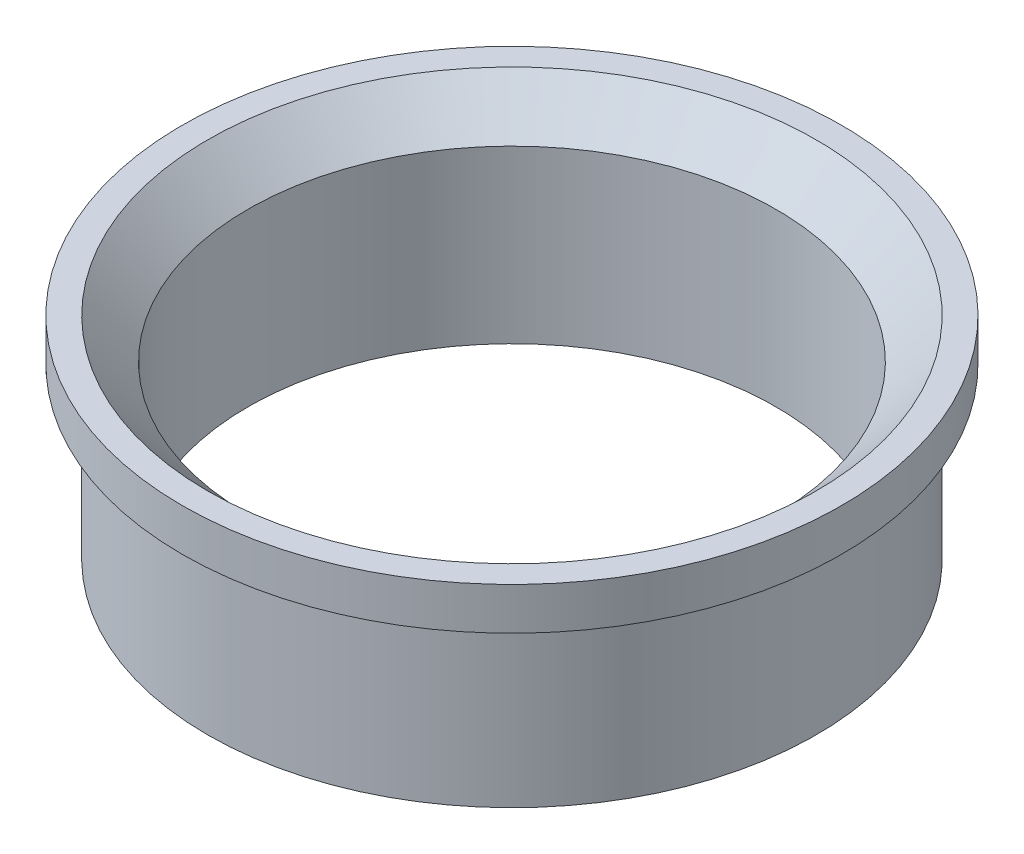
ISO-10303-21;
HEADER;
FILE_DESCRIPTION(('STEP AP214'),'2;1');
FILE_NAME('part.step','',(''),(''),'','','');
FILE_SCHEMA(('AUTOMOTIVE_DESIGN { 1 0 10303 214 1 1 1 1 }'));
ENDSEC;
DATA;
#1=APPLICATION_CONTEXT('core data for automotive mechanical design processes');
#2=APPLICATION_PROTOCOL_DEFINITION('international standard','automotive_design',2000,#1);
#3=PRODUCT_CONTEXT('',#1,'mechanical');
#4=PRODUCT('Part','Part','',(#3));
#5=PRODUCT_RELATED_PRODUCT_CATEGORY('part','',(#4));
#6=PRODUCT_DEFINITION_FORMATION('','',#4);
#7=PRODUCT_DEFINITION_CONTEXT('part definition',#1,'design');
#8=PRODUCT_DEFINITION('design','',#6,#7);
#9=PRODUCT_DEFINITION_SHAPE('','',#8);
#10=(LENGTH_UNIT() NAMED_UNIT(*) SI_UNIT(.MILLI.,.METRE.));
#11=(NAMED_UNIT(*) PLANE_ANGLE_UNIT() SI_UNIT($,.RADIAN.));
#12=(NAMED_UNIT(*) SI_UNIT($,.STERADIAN.) SOLID_ANGLE_UNIT());
#13=UNCERTAINTY_MEASURE_WITH_UNIT(LENGTH_MEASURE(1.E-05),#10,'distance_accuracy_value','');
#14=(GEOMETRIC_REPRESENTATION_CONTEXT(3) GLOBAL_UNCERTAINTY_ASSIGNED_CONTEXT((#13)) GLOBAL_UNIT_ASSIGNED_CONTEXT((#10,
#11,#12)) REPRESENTATION_CONTEXT('',''));
#15=CARTESIAN_POINT('',(0.,0.,0.));
#16=DIRECTION('',(0.,0.,1.));
#17=DIRECTION('',(1.,0.,0.));
#18=AXIS2_PLACEMENT_3D('',#15,#16,#17);
#19=CARTESIAN_POINT('',(0.,30.6377309557648,0.));
#20=DIRECTION('',(0.,1.,0.));
#21=DIRECTION('',(0.,0.,1.));
#22=AXIS2_PLACEMENT_3D('',#19,#20,#21);
#23=CONICAL_SURFACE('',#22,62.5,0.785398163397443);
#24=CARTESIAN_POINT('',(0.,40.1377309557649,0.));
#25=DIRECTION('',(0.,1.,0.));
#26=DIRECTION('',(0.,0.,1.));
#27=AXIS2_PLACEMENT_3D('',#24,#25,#26);
#28=CIRCLE('',#27,72.);
#29=CARTESIAN_POINT('',(0.,40.1377309557649,72.));
#30=VERTEX_POINT('',#29);
#31=EDGE_CURVE('E10',#30,#30,#28,.T.);
#32=ORIENTED_EDGE('',*,*,#31,.T.);
#33=EDGE_LOOP('',(#32));
#34=FACE_BOUND('',#33,.T.);
#35=CARTESIAN_POINT('',(0.,30.6377309557648,0.));
#36=DIRECTION('',(0.,1.,0.));
#37=DIRECTION('',(0.,0.,1.));
#38=AXIS2_PLACEMENT_3D('',#35,#36,#37);
#39=CIRCLE('',#38,62.5);
#40=CARTESIAN_POINT('',(0.,30.6377309557648,62.5));
#41=VERTEX_POINT('',#40);
#42=EDGE_CURVE('E56',#41,#41,#39,.T.);
#43=ORIENTED_EDGE('',*,*,#42,.F.);
#44=EDGE_LOOP('',(#43));
#45=FACE_BOUND('',#44,.T.);
#46=ADVANCED_FACE('F31',(#34,#45),#23,.F.);
#47=CARTESIAN_POINT('',(-72.,40.1377309557649,0.));
#48=DIRECTION('',(0.,1.,0.));
#49=DIRECTION('',(0.,0.,1.));
#50=AXIS2_PLACEMENT_3D('',#47,#48,#49);
#51=PLANE('',#50);
#52=CARTESIAN_POINT('',(0.,40.1377309557649,0.));
#53=DIRECTION('',(0.,1.,0.));
#54=DIRECTION('',(0.,0.,1.));
#55=AXIS2_PLACEMENT_3D('',#52,#53,#54);
#56=CIRCLE('',#55,78.);
#57=CARTESIAN_POINT('',(0.,40.1377309557649,78.));
#58=VERTEX_POINT('',#57);
#59=EDGE_CURVE('E37',#58,#58,#56,.T.);
#60=ORIENTED_EDGE('',*,*,#59,.T.);
#61=EDGE_LOOP('',(#60));
#62=FACE_BOUND('',#61,.T.);
#63=ORIENTED_EDGE('',*,*,#31,.F.);
#64=EDGE_LOOP('',(#63));
#65=FACE_BOUND('',#64,.T.);
#66=ADVANCED_FACE('F64',(#62,#65),#51,.T.);
#67=CARTESIAN_POINT('',(0.,73.4829228267081,0.));
#68=DIRECTION('',(0.,1.,0.));
#69=DIRECTION('',(0.,0.,1.));
#70=AXIS2_PLACEMENT_3D('',#67,#68,#69);
#71=CYLINDRICAL_SURFACE('',#70,78.);
#72=CARTESIAN_POINT('',(0.,30.1377309557649,0.));
#73=DIRECTION('',(0.,1.,0.));
#74=DIRECTION('',(0.,0.,1.));
#75=AXIS2_PLACEMENT_3D('',#72,#73,#74);
#76=CIRCLE('',#75,78.);
#77=CARTESIAN_POINT('',(0.,30.1377309557649,78.));
#78=VERTEX_POINT('',#77);
#79=EDGE_CURVE('E41',#78,#78,#76,.T.);
#80=ORIENTED_EDGE('',*,*,#79,.T.);
#81=EDGE_LOOP('',(#80));
#82=FACE_BOUND('',#81,.T.);
#83=ORIENTED_EDGE('',*,*,#59,.F.);
#84=EDGE_LOOP('',(#83));
#85=FACE_BOUND('',#84,.T.);
#86=ADVANCED_FACE('F68',(#82,#85),#71,.T.);
#87=CARTESIAN_POINT('',(-78.,30.1377309557649,0.));
#88=DIRECTION('',(0.,-1.,0.));
#89=DIRECTION('',(0.,0.,-1.));
#90=AXIS2_PLACEMENT_3D('',#87,#88,#89);
#91=PLANE('',#90);
#92=CARTESIAN_POINT('',(0.,30.1377309557649,0.));
#93=DIRECTION('',(0.,1.,0.));
#94=DIRECTION('',(0.,0.,1.));
#95=AXIS2_PLACEMENT_3D('',#92,#93,#94);
#96=CIRCLE('',#95,72.);
#97=CARTESIAN_POINT('',(0.,30.1377309557649,72.));
#98=VERTEX_POINT('',#97);
#99=EDGE_CURVE('E45',#98,#98,#96,.T.);
#100=ORIENTED_EDGE('',*,*,#99,.T.);
#101=EDGE_LOOP('',(#100));
#102=FACE_BOUND('',#101,.T.);
#103=ORIENTED_EDGE('',*,*,#79,.F.);
#104=EDGE_LOOP('',(#103));
#105=FACE_BOUND('',#104,.T.);
#106=ADVANCED_FACE('F72',(#102,#105),#91,.T.);
#107=CARTESIAN_POINT('',(0.,73.4829228267081,0.));
#108=DIRECTION('',(0.,1.,0.));
#109=DIRECTION('',(0.,0.,1.));
#110=AXIS2_PLACEMENT_3D('',#107,#108,#109);
#111=CYLINDRICAL_SURFACE('',#110,72.);
#112=CARTESIAN_POINT('',(0.,-9.8622690442351,0.));
#113=DIRECTION('',(0.,1.,0.));
#114=DIRECTION('',(0.,0.,1.));
#115=AXIS2_PLACEMENT_3D('',#112,#113,#114);
#116=CIRCLE('',#115,72.);
#117=CARTESIAN_POINT('',(0.,-9.8622690442351,72.));
#118=VERTEX_POINT('',#117);
#119=EDGE_CURVE('E50',#118,#118,#116,.T.);
#120=ORIENTED_EDGE('',*,*,#119,.T.);
#121=EDGE_LOOP('',(#120));
#122=FACE_BOUND('',#121,.T.);
#123=ORIENTED_EDGE('',*,*,#99,.F.);
#124=EDGE_LOOP('',(#123));
#125=FACE_BOUND('',#124,.T.);
#126=ADVANCED_FACE('F79',(#122,#125),#111,.T.);
#127=CARTESIAN_POINT('',(-72.,-9.8622690442351,0.));
#128=DIRECTION('',(0.,-1.,0.));
#129=DIRECTION('',(0.,0.,-1.));
#130=AXIS2_PLACEMENT_3D('',#127,#128,#129);
#131=PLANE('',#130);
#132=CARTESIAN_POINT('',(0.,-9.8622690442351,0.));
#133=DIRECTION('',(0.,1.,0.));
#134=DIRECTION('',(0.,0.,1.));
#135=AXIS2_PLACEMENT_3D('',#132,#133,#134);
#136=CIRCLE('',#135,62.5);
#137=CARTESIAN_POINT('',(0.,-9.8622690442351,62.5));
#138=VERTEX_POINT('',#137);
#139=EDGE_CURVE('E53',#138,#138,#136,.T.);
#140=ORIENTED_EDGE('',*,*,#139,.T.);
#141=EDGE_LOOP('',(#140));
#142=FACE_BOUND('',#141,.T.);
#143=ORIENTED_EDGE('',*,*,#119,.F.);
#144=EDGE_LOOP('',(#143));
#145=FACE_BOUND('',#144,.T.);
#146=ADVANCED_FACE('F83',(#142,#145),#131,.T.);
#147=CARTESIAN_POINT('',(0.,73.4829228267081,0.));
#148=DIRECTION('',(0.,1.,0.));
#149=DIRECTION('',(0.,0.,1.));
#150=AXIS2_PLACEMENT_3D('',#147,#148,#149);
#151=CYLINDRICAL_SURFACE('',#150,62.5);
#152=ORIENTED_EDGE('',*,*,#42,.T.);
#153=EDGE_LOOP('',(#152));
#154=FACE_BOUND('',#153,.T.);
#155=ORIENTED_EDGE('',*,*,#139,.F.);
#156=EDGE_LOOP('',(#155));
#157=FACE_BOUND('',#156,.T.);
#158=ADVANCED_FACE('F60',(#154,#157),#151,.F.);
#159=CLOSED_SHELL('',(#46,#66,#86,#106,#126,#146,#158));
#160=MANIFOLD_SOLID_BREP('B2',#159);
#161=ADVANCED_BREP_SHAPE_REPRESENTATION('',(#18,#160),#14);
#162=SHAPE_DEFINITION_REPRESENTATION(#9,#161);
ENDSEC;
END-ISO-10303-21;
